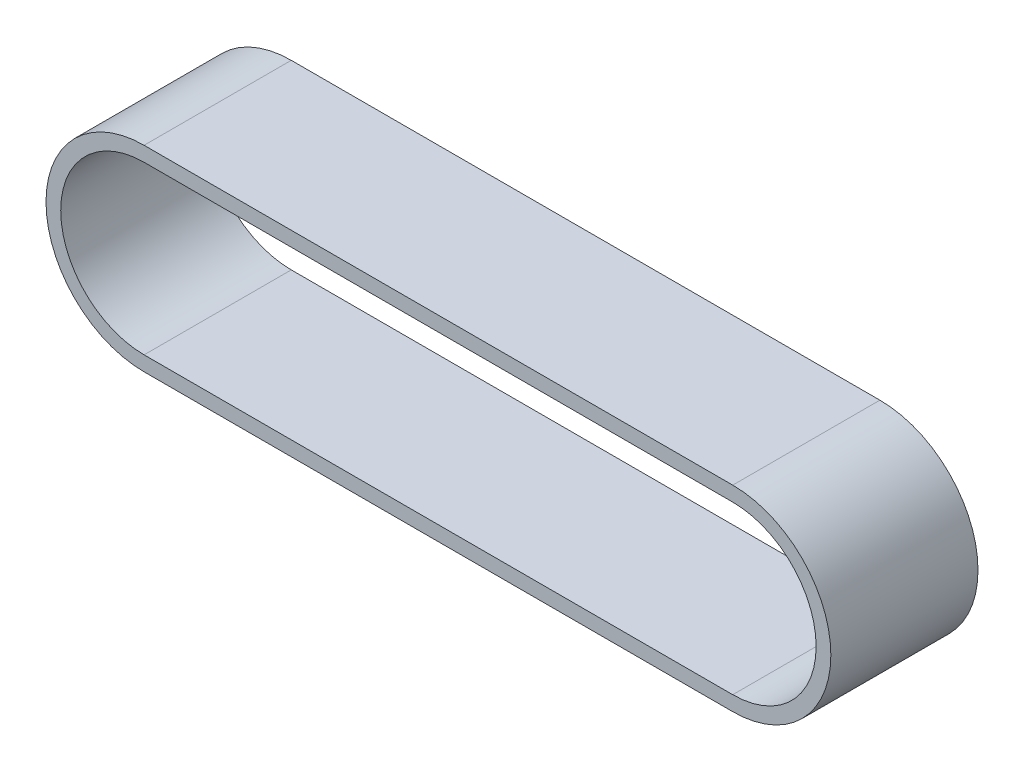
ISO-10303-21;
HEADER;
FILE_DESCRIPTION(('STEP AP214'),'2;1');
FILE_NAME('part.step','',(''),(''),'','','');
FILE_SCHEMA(('AUTOMOTIVE_DESIGN { 1 0 10303 214 1 1 1 1 }'));
ENDSEC;
DATA;
#1=APPLICATION_CONTEXT('core data for automotive mechanical design processes');
#2=APPLICATION_PROTOCOL_DEFINITION('international standard','automotive_design',2000,#1);
#3=PRODUCT_CONTEXT('',#1,'mechanical');
#4=PRODUCT('Part','Part','',(#3));
#5=PRODUCT_RELATED_PRODUCT_CATEGORY('part','',(#4));
#6=PRODUCT_DEFINITION_FORMATION('','',#4);
#7=PRODUCT_DEFINITION_CONTEXT('part definition',#1,'design');
#8=PRODUCT_DEFINITION('design','',#6,#7);
#9=PRODUCT_DEFINITION_SHAPE('','',#8);
#10=(LENGTH_UNIT() NAMED_UNIT(*) SI_UNIT(.MILLI.,.METRE.));
#11=(NAMED_UNIT(*) PLANE_ANGLE_UNIT() SI_UNIT($,.RADIAN.));
#12=(NAMED_UNIT(*) SI_UNIT($,.STERADIAN.) SOLID_ANGLE_UNIT());
#13=UNCERTAINTY_MEASURE_WITH_UNIT(LENGTH_MEASURE(1.E-05),#10,'distance_accuracy_value','');
#14=(GEOMETRIC_REPRESENTATION_CONTEXT(3) GLOBAL_UNCERTAINTY_ASSIGNED_CONTEXT((#13)) GLOBAL_UNIT_ASSIGNED_CONTEXT((#10,
#11,#12)) REPRESENTATION_CONTEXT('',''));
#15=CARTESIAN_POINT('',(0.,0.,0.));
#16=DIRECTION('',(0.,0.,1.));
#17=DIRECTION('',(1.,0.,0.));
#18=AXIS2_PLACEMENT_3D('',#15,#16,#17);
#19=CARTESIAN_POINT('',(0.,-20.,30.));
#20=DIRECTION('',(0.,1.,0.));
#21=DIRECTION('',(0.,0.,1.));
#22=AXIS2_PLACEMENT_3D('',#19,#20,#21);
#23=PLANE('',#22);
#24=DIRECTION('',(1.,0.,0.));
#25=VECTOR('',#24,1.);
#26=CARTESIAN_POINT('',(0.,-20.,0.));
#27=LINE('',#26,#25);
#28=CARTESIAN_POINT('',(-60.,-20.,0.));
#29=VERTEX_POINT('',#28);
#30=CARTESIAN_POINT('',(60.,-20.,0.));
#31=VERTEX_POINT('',#30);
#32=EDGE_CURVE('E138',#29,#31,#27,.T.);
#33=ORIENTED_EDGE('',*,*,#32,.T.);
#34=DIRECTION('',(0.,0.,-1.));
#35=VECTOR('',#34,1.);
#36=CARTESIAN_POINT('',(60.,-20.,30.));
#37=LINE('',#36,#35);
#38=CARTESIAN_POINT('',(60.,-20.,30.));
#39=VERTEX_POINT('',#38);
#40=EDGE_CURVE('E11',#39,#31,#37,.T.);
#41=ORIENTED_EDGE('',*,*,#40,.F.);
#42=DIRECTION('',(1.,0.,0.));
#43=VECTOR('',#42,1.);
#44=CARTESIAN_POINT('',(0.,-20.,30.));
#45=LINE('',#44,#43);
#46=CARTESIAN_POINT('',(-60.,-20.,30.));
#47=VERTEX_POINT('',#46);
#48=EDGE_CURVE('E118',#47,#39,#45,.T.);
#49=ORIENTED_EDGE('',*,*,#48,.F.);
#50=DIRECTION('',(0.,0.,-1.));
#51=VECTOR('',#50,1.);
#52=CARTESIAN_POINT('',(-60.,-20.,30.));
#53=LINE('',#52,#51);
#54=EDGE_CURVE('E145',#47,#29,#53,.T.);
#55=ORIENTED_EDGE('',*,*,#54,.T.);
#56=EDGE_LOOP('',(#33,#41,#49,#55));
#57=FACE_BOUND('',#56,.T.);
#58=ADVANCED_FACE('F32',(#57),#23,.F.);
#59=CARTESIAN_POINT('',(60.,0.,30.));
#60=DIRECTION('',(0.,0.,-1.));
#61=DIRECTION('',(-1.,0.,0.));
#62=AXIS2_PLACEMENT_3D('',#59,#60,#61);
#63=CYLINDRICAL_SURFACE('',#62,20.);
#64=CARTESIAN_POINT('',(60.,0.,0.));
#65=DIRECTION('',(0.,0.,1.));
#66=DIRECTION('',(1.,0.,0.));
#67=AXIS2_PLACEMENT_3D('',#64,#65,#66);
#68=CIRCLE('',#67,20.);
#69=CARTESIAN_POINT('',(60.,20.,0.));
#70=VERTEX_POINT('',#69);
#71=EDGE_CURVE('E109',#70,#31,#68,.F.);
#72=ORIENTED_EDGE('',*,*,#71,.F.);
#73=DIRECTION('',(0.,0.,-1.));
#74=VECTOR('',#73,1.);
#75=CARTESIAN_POINT('',(60.,20.,30.));
#76=LINE('',#75,#74);
#77=CARTESIAN_POINT('',(60.,20.,30.));
#78=VERTEX_POINT('',#77);
#79=EDGE_CURVE('E42',#78,#70,#76,.T.);
#80=ORIENTED_EDGE('',*,*,#79,.F.);
#81=CARTESIAN_POINT('',(60.,0.,30.));
#82=DIRECTION('',(0.,0.,1.));
#83=DIRECTION('',(1.,0.,0.));
#84=AXIS2_PLACEMENT_3D('',#81,#82,#83);
#85=CIRCLE('',#84,20.);
#86=EDGE_CURVE('E107',#78,#39,#85,.F.);
#87=ORIENTED_EDGE('',*,*,#86,.T.);
#88=ORIENTED_EDGE('',*,*,#40,.T.);
#89=EDGE_LOOP('',(#72,#80,#87,#88));
#90=FACE_BOUND('',#89,.T.);
#91=ADVANCED_FACE('F106',(#90),#63,.T.);
#92=CARTESIAN_POINT('',(0.,20.,30.));
#93=DIRECTION('',(0.,1.,0.));
#94=DIRECTION('',(0.,0.,1.));
#95=AXIS2_PLACEMENT_3D('',#92,#93,#94);
#96=PLANE('',#95);
#97=DIRECTION('',(1.,0.,0.));
#98=VECTOR('',#97,1.);
#99=CARTESIAN_POINT('',(0.,20.,0.));
#100=LINE('',#99,#98);
#101=CARTESIAN_POINT('',(-60.,20.,0.));
#102=VERTEX_POINT('',#101);
#103=EDGE_CURVE('E142',#102,#70,#100,.T.);
#104=ORIENTED_EDGE('',*,*,#103,.F.);
#105=DIRECTION('',(0.,0.,-1.));
#106=VECTOR('',#105,1.);
#107=CARTESIAN_POINT('',(-60.,20.,30.));
#108=LINE('',#107,#106);
#109=CARTESIAN_POINT('',(-60.,20.,30.));
#110=VERTEX_POINT('',#109);
#111=EDGE_CURVE('E78',#110,#102,#108,.T.);
#112=ORIENTED_EDGE('',*,*,#111,.F.);
#113=DIRECTION('',(1.,0.,0.));
#114=VECTOR('',#113,1.);
#115=CARTESIAN_POINT('',(0.,20.,30.));
#116=LINE('',#115,#114);
#117=EDGE_CURVE('E116',#110,#78,#116,.T.);
#118=ORIENTED_EDGE('',*,*,#117,.T.);
#119=ORIENTED_EDGE('',*,*,#79,.T.);
#120=EDGE_LOOP('',(#104,#112,#118,#119));
#121=FACE_BOUND('',#120,.T.);
#122=ADVANCED_FACE('F121',(#121),#96,.T.);
#123=CARTESIAN_POINT('',(60.,0.,30.));
#124=DIRECTION('',(0.,0.,-1.));
#125=DIRECTION('',(-1.,0.,0.));
#126=AXIS2_PLACEMENT_3D('',#123,#124,#125);
#127=CYLINDRICAL_SURFACE('',#126,17.);
#128=CARTESIAN_POINT('',(60.,0.,0.));
#129=DIRECTION('',(0.,0.,1.));
#130=DIRECTION('',(1.,0.,0.));
#131=AXIS2_PLACEMENT_3D('',#128,#129,#130);
#132=CIRCLE('',#131,17.);
#133=CARTESIAN_POINT('',(60.,17.,0.));
#134=VERTEX_POINT('',#133);
#135=CARTESIAN_POINT('',(60.,-17.,0.));
#136=VERTEX_POINT('',#135);
#137=EDGE_CURVE('E127',#134,#136,#132,.F.);
#138=ORIENTED_EDGE('',*,*,#137,.T.);
#139=DIRECTION('',(0.,0.,-1.));
#140=VECTOR('',#139,1.);
#141=CARTESIAN_POINT('',(60.,-17.,30.));
#142=LINE('',#141,#140);
#143=CARTESIAN_POINT('',(60.,-17.,30.));
#144=VERTEX_POINT('',#143);
#145=EDGE_CURVE('E36',#144,#136,#142,.T.);
#146=ORIENTED_EDGE('',*,*,#145,.F.);
#147=CARTESIAN_POINT('',(60.,0.,30.));
#148=DIRECTION('',(0.,0.,1.));
#149=DIRECTION('',(1.,0.,0.));
#150=AXIS2_PLACEMENT_3D('',#147,#148,#149);
#151=CIRCLE('',#150,17.);
#152=CARTESIAN_POINT('',(60.,17.,30.));
#153=VERTEX_POINT('',#152);
#154=EDGE_CURVE('E90',#153,#144,#151,.F.);
#155=ORIENTED_EDGE('',*,*,#154,.F.);
#156=DIRECTION('',(0.,0.,-1.));
#157=VECTOR('',#156,1.);
#158=CARTESIAN_POINT('',(60.,17.,30.));
#159=LINE('',#158,#157);
#160=EDGE_CURVE('E123',#153,#134,#159,.T.);
#161=ORIENTED_EDGE('',*,*,#160,.T.);
#162=EDGE_LOOP('',(#138,#146,#155,#161));
#163=FACE_BOUND('',#162,.T.);
#164=ADVANCED_FACE('F34',(#163),#127,.F.);
#165=CARTESIAN_POINT('',(0.,-17.,30.));
#166=DIRECTION('',(0.,1.,0.));
#167=DIRECTION('',(0.,0.,1.));
#168=AXIS2_PLACEMENT_3D('',#165,#166,#167);
#169=PLANE('',#168);
#170=DIRECTION('',(1.,0.,0.));
#171=VECTOR('',#170,1.);
#172=CARTESIAN_POINT('',(0.,-17.,0.));
#173=LINE('',#172,#171);
#174=CARTESIAN_POINT('',(-60.,-17.,0.));
#175=VERTEX_POINT('',#174);
#176=EDGE_CURVE('E130',#175,#136,#173,.T.);
#177=ORIENTED_EDGE('',*,*,#176,.F.);
#178=DIRECTION('',(0.,0.,-1.));
#179=VECTOR('',#178,1.);
#180=CARTESIAN_POINT('',(-60.,-17.,30.));
#181=LINE('',#180,#179);
#182=CARTESIAN_POINT('',(-60.,-17.,30.));
#183=VERTEX_POINT('',#182);
#184=EDGE_CURVE('E151',#183,#175,#181,.T.);
#185=ORIENTED_EDGE('',*,*,#184,.F.);
#186=DIRECTION('',(1.,0.,0.));
#187=VECTOR('',#186,1.);
#188=CARTESIAN_POINT('',(0.,-17.,30.));
#189=LINE('',#188,#187);
#190=EDGE_CURVE('E159',#183,#144,#189,.T.);
#191=ORIENTED_EDGE('',*,*,#190,.T.);
#192=ORIENTED_EDGE('',*,*,#145,.T.);
#193=EDGE_LOOP('',(#177,#185,#191,#192));
#194=FACE_BOUND('',#193,.T.);
#195=ADVANCED_FACE('F158',(#194),#169,.T.);
#196=CARTESIAN_POINT('',(-60.,0.,30.));
#197=DIRECTION('',(0.,0.,-1.));
#198=DIRECTION('',(-1.,0.,0.));
#199=AXIS2_PLACEMENT_3D('',#196,#197,#198);
#200=CYLINDRICAL_SURFACE('',#199,17.);
#201=CARTESIAN_POINT('',(-60.,0.,0.));
#202=DIRECTION('',(0.,0.,1.));
#203=DIRECTION('',(1.,0.,0.));
#204=AXIS2_PLACEMENT_3D('',#201,#202,#203);
#205=CIRCLE('',#204,17.);
#206=CARTESIAN_POINT('',(-60.,17.,0.));
#207=VERTEX_POINT('',#206);
#208=EDGE_CURVE('E133',#207,#175,#205,.T.);
#209=ORIENTED_EDGE('',*,*,#208,.F.);
#210=DIRECTION('',(0.,0.,-1.));
#211=VECTOR('',#210,1.);
#212=CARTESIAN_POINT('',(-60.,17.,30.));
#213=LINE('',#212,#211);
#214=CARTESIAN_POINT('',(-60.,17.,30.));
#215=VERTEX_POINT('',#214);
#216=EDGE_CURVE('E150',#215,#207,#213,.T.);
#217=ORIENTED_EDGE('',*,*,#216,.F.);
#218=CARTESIAN_POINT('',(-60.,0.,30.));
#219=DIRECTION('',(0.,0.,1.));
#220=DIRECTION('',(1.,0.,0.));
#221=AXIS2_PLACEMENT_3D('',#218,#219,#220);
#222=CIRCLE('',#221,17.);
#223=EDGE_CURVE('E170',#215,#183,#222,.T.);
#224=ORIENTED_EDGE('',*,*,#223,.T.);
#225=ORIENTED_EDGE('',*,*,#184,.T.);
#226=EDGE_LOOP('',(#209,#217,#224,#225));
#227=FACE_BOUND('',#226,.T.);
#228=ADVANCED_FACE('F167',(#227),#200,.F.);
#229=CARTESIAN_POINT('',(0.,17.,30.));
#230=DIRECTION('',(0.,1.,0.));
#231=DIRECTION('',(0.,0.,1.));
#232=AXIS2_PLACEMENT_3D('',#229,#230,#231);
#233=PLANE('',#232);
#234=DIRECTION('',(1.,0.,0.));
#235=VECTOR('',#234,1.);
#236=CARTESIAN_POINT('',(0.,17.,0.));
#237=LINE('',#236,#235);
#238=EDGE_CURVE('E136',#207,#134,#237,.T.);
#239=ORIENTED_EDGE('',*,*,#238,.T.);
#240=ORIENTED_EDGE('',*,*,#160,.F.);
#241=DIRECTION('',(1.,0.,0.));
#242=VECTOR('',#241,1.);
#243=CARTESIAN_POINT('',(0.,17.,30.));
#244=LINE('',#243,#242);
#245=EDGE_CURVE('E172',#215,#153,#244,.T.);
#246=ORIENTED_EDGE('',*,*,#245,.F.);
#247=ORIENTED_EDGE('',*,*,#216,.T.);
#248=EDGE_LOOP('',(#239,#240,#246,#247));
#249=FACE_BOUND('',#248,.T.);
#250=ADVANCED_FACE('F173',(#249),#233,.F.);
#251=CARTESIAN_POINT('',(-60.,0.,30.));
#252=DIRECTION('',(0.,0.,-1.));
#253=DIRECTION('',(-1.,0.,0.));
#254=AXIS2_PLACEMENT_3D('',#251,#252,#253);
#255=CYLINDRICAL_SURFACE('',#254,20.);
#256=CARTESIAN_POINT('',(-60.,0.,0.));
#257=DIRECTION('',(0.,0.,1.));
#258=DIRECTION('',(1.,0.,0.));
#259=AXIS2_PLACEMENT_3D('',#256,#257,#258);
#260=CIRCLE('',#259,20.);
#261=EDGE_CURVE('E81',#102,#29,#260,.T.);
#262=ORIENTED_EDGE('',*,*,#261,.T.);
#263=ORIENTED_EDGE('',*,*,#54,.F.);
#264=CARTESIAN_POINT('',(-60.,0.,30.));
#265=DIRECTION('',(0.,0.,1.));
#266=DIRECTION('',(1.,0.,0.));
#267=AXIS2_PLACEMENT_3D('',#264,#265,#266);
#268=CIRCLE('',#267,20.);
#269=EDGE_CURVE('E51',#110,#47,#268,.T.);
#270=ORIENTED_EDGE('',*,*,#269,.F.);
#271=ORIENTED_EDGE('',*,*,#111,.T.);
#272=EDGE_LOOP('',(#262,#263,#270,#271));
#273=FACE_BOUND('',#272,.T.);
#274=ADVANCED_FACE('F179',(#273),#255,.T.);
#275=CARTESIAN_POINT('',(0.,0.,30.));
#276=DIRECTION('',(0.,0.,1.));
#277=DIRECTION('',(1.,0.,0.));
#278=AXIS2_PLACEMENT_3D('',#275,#276,#277);
#279=PLANE('',#278);
#280=ORIENTED_EDGE('',*,*,#154,.T.);
#281=ORIENTED_EDGE('',*,*,#190,.F.);
#282=ORIENTED_EDGE('',*,*,#223,.F.);
#283=ORIENTED_EDGE('',*,*,#245,.T.);
#284=EDGE_LOOP('',(#280,#281,#282,#283));
#285=FACE_BOUND('',#284,.T.);
#286=ORIENTED_EDGE('',*,*,#48,.T.);
#287=ORIENTED_EDGE('',*,*,#86,.F.);
#288=ORIENTED_EDGE('',*,*,#117,.F.);
#289=ORIENTED_EDGE('',*,*,#269,.T.);
#290=EDGE_LOOP('',(#286,#287,#288,#289));
#291=FACE_BOUND('',#290,.T.);
#292=ADVANCED_FACE('F115',(#285,#291),#279,.T.);
#293=CARTESIAN_POINT('',(0.,0.,0.));
#294=DIRECTION('',(0.,0.,1.));
#295=DIRECTION('',(1.,0.,0.));
#296=AXIS2_PLACEMENT_3D('',#293,#294,#295);
#297=PLANE('',#296);
#298=ORIENTED_EDGE('',*,*,#137,.F.);
#299=ORIENTED_EDGE('',*,*,#238,.F.);
#300=ORIENTED_EDGE('',*,*,#208,.T.);
#301=ORIENTED_EDGE('',*,*,#176,.T.);
#302=EDGE_LOOP('',(#298,#299,#300,#301));
#303=FACE_BOUND('',#302,.T.);
#304=ORIENTED_EDGE('',*,*,#32,.F.);
#305=ORIENTED_EDGE('',*,*,#261,.F.);
#306=ORIENTED_EDGE('',*,*,#103,.T.);
#307=ORIENTED_EDGE('',*,*,#71,.T.);
#308=EDGE_LOOP('',(#304,#305,#306,#307));
#309=FACE_BOUND('',#308,.T.);
#310=ADVANCED_FACE('F165',(#303,#309),#297,.F.);
#311=CLOSED_SHELL('',(#58,#91,#122,#164,#195,#228,#250,#274,#292,#310));
#312=MANIFOLD_SOLID_BREP('B2',#311);
#313=ADVANCED_BREP_SHAPE_REPRESENTATION('',(#18,#312),#14);
#314=SHAPE_DEFINITION_REPRESENTATION(#9,#313);
ENDSEC;
END-ISO-10303-21;
